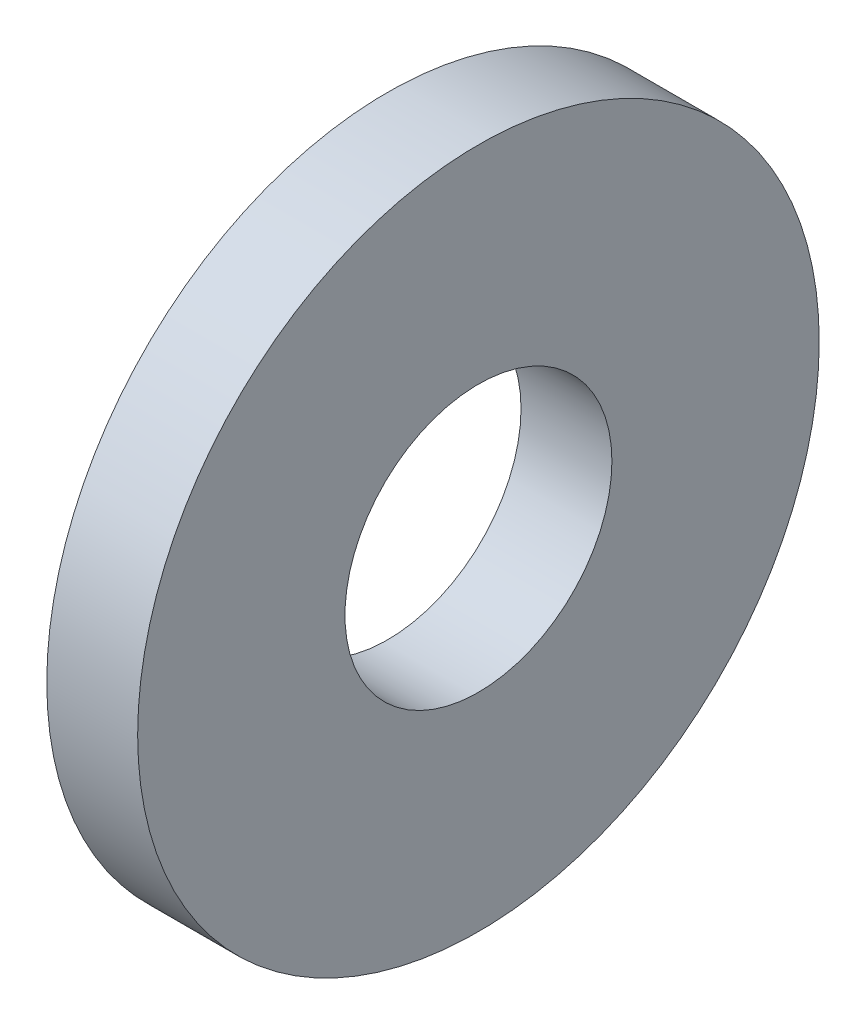
ISO-10303-21;
HEADER;
FILE_DESCRIPTION(('STEP AP214'),'2;1');
FILE_NAME('part.step','',(''),(''),'','','');
FILE_SCHEMA(('AUTOMOTIVE_DESIGN { 1 0 10303 214 1 1 1 1 }'));
ENDSEC;
DATA;
#1=APPLICATION_CONTEXT('core data for automotive mechanical design processes');
#2=APPLICATION_PROTOCOL_DEFINITION('international standard','automotive_design',2000,#1);
#3=PRODUCT_CONTEXT('',#1,'mechanical');
#4=PRODUCT('Part','Part','',(#3));
#5=PRODUCT_RELATED_PRODUCT_CATEGORY('part','',(#4));
#6=PRODUCT_DEFINITION_FORMATION('','',#4);
#7=PRODUCT_DEFINITION_CONTEXT('part definition',#1,'design');
#8=PRODUCT_DEFINITION('design','',#6,#7);
#9=PRODUCT_DEFINITION_SHAPE('','',#8);
#10=(LENGTH_UNIT() NAMED_UNIT(*) SI_UNIT(.MILLI.,.METRE.));
#11=(NAMED_UNIT(*) PLANE_ANGLE_UNIT() SI_UNIT($,.RADIAN.));
#12=(NAMED_UNIT(*) SI_UNIT($,.STERADIAN.) SOLID_ANGLE_UNIT());
#13=UNCERTAINTY_MEASURE_WITH_UNIT(LENGTH_MEASURE(1.E-05),#10,'distance_accuracy_value','');
#14=(GEOMETRIC_REPRESENTATION_CONTEXT(3) GLOBAL_UNCERTAINTY_ASSIGNED_CONTEXT((#13)) GLOBAL_UNIT_ASSIGNED_CONTEXT((#10,
#11,#12)) REPRESENTATION_CONTEXT('',''));
#15=CARTESIAN_POINT('',(0.,0.,0.));
#16=DIRECTION('',(0.,0.,1.));
#17=DIRECTION('',(1.,0.,0.));
#18=AXIS2_PLACEMENT_3D('',#15,#16,#17);
#19=CARTESIAN_POINT('',(1.6,0.,0.));
#20=DIRECTION('',(1.,0.,0.));
#21=DIRECTION('',(0.,0.,-1.));
#22=AXIS2_PLACEMENT_3D('',#19,#20,#21);
#23=PLANE('',#22);
#24=CARTESIAN_POINT('',(1.6,0.,0.));
#25=DIRECTION('',(1.,0.,0.));
#26=DIRECTION('',(0.,0.,-1.));
#27=AXIS2_PLACEMENT_3D('',#24,#25,#26);
#28=CIRCLE('',#27,6.);
#29=CARTESIAN_POINT('',(1.6,0.,-6.));
#30=VERTEX_POINT('',#29);
#31=EDGE_CURVE('E10',#30,#30,#28,.T.);
#32=ORIENTED_EDGE('',*,*,#31,.T.);
#33=EDGE_LOOP('',(#32));
#34=FACE_BOUND('',#33,.T.);
#35=CARTESIAN_POINT('',(1.6,0.,0.));
#36=DIRECTION('',(1.,0.,0.));
#37=DIRECTION('',(0.,0.,-1.));
#38=AXIS2_PLACEMENT_3D('',#35,#36,#37);
#39=CIRCLE('',#38,2.35);
#40=CARTESIAN_POINT('',(1.6,0.,-2.35));
#41=VERTEX_POINT('',#40);
#42=EDGE_CURVE('E48',#41,#41,#39,.T.);
#43=ORIENTED_EDGE('',*,*,#42,.F.);
#44=EDGE_LOOP('',(#43));
#45=FACE_BOUND('',#44,.T.);
#46=ADVANCED_FACE('F37',(#34,#45),#23,.T.);
#47=CARTESIAN_POINT('',(0.,0.,0.));
#48=DIRECTION('',(1.,0.,0.));
#49=DIRECTION('',(0.,0.,-1.));
#50=AXIS2_PLACEMENT_3D('',#47,#48,#49);
#51=PLANE('',#50);
#52=CARTESIAN_POINT('',(0.,0.,0.));
#53=DIRECTION('',(1.,0.,0.));
#54=DIRECTION('',(0.,0.,-1.));
#55=AXIS2_PLACEMENT_3D('',#52,#53,#54);
#56=CIRCLE('',#55,6.);
#57=CARTESIAN_POINT('',(0.,0.,-6.));
#58=VERTEX_POINT('',#57);
#59=EDGE_CURVE('E41',#58,#58,#56,.T.);
#60=ORIENTED_EDGE('',*,*,#59,.F.);
#61=EDGE_LOOP('',(#60));
#62=FACE_BOUND('',#61,.T.);
#63=CARTESIAN_POINT('',(0.,0.,0.));
#64=DIRECTION('',(1.,0.,0.));
#65=DIRECTION('',(0.,0.,-1.));
#66=AXIS2_PLACEMENT_3D('',#63,#64,#65);
#67=CIRCLE('',#66,2.35);
#68=CARTESIAN_POINT('',(0.,0.,-2.35));
#69=VERTEX_POINT('',#68);
#70=EDGE_CURVE('E50',#69,#69,#67,.T.);
#71=ORIENTED_EDGE('',*,*,#70,.T.);
#72=EDGE_LOOP('',(#71));
#73=FACE_BOUND('',#72,.T.);
#74=ADVANCED_FACE('F60',(#62,#73),#51,.F.);
#75=CARTESIAN_POINT('',(1.6,0.,0.));
#76=DIRECTION('',(-1.,0.,0.));
#77=DIRECTION('',(0.,0.,1.));
#78=AXIS2_PLACEMENT_3D('',#75,#76,#77);
#79=CYLINDRICAL_SURFACE('',#78,6.);
#80=ORIENTED_EDGE('',*,*,#31,.F.);
#81=EDGE_LOOP('',(#80));
#82=FACE_BOUND('',#81,.T.);
#83=ORIENTED_EDGE('',*,*,#59,.T.);
#84=EDGE_LOOP('',(#83));
#85=FACE_BOUND('',#84,.T.);
#86=ADVANCED_FACE('F39',(#82,#85),#79,.T.);
#87=CARTESIAN_POINT('',(1.6,0.,0.));
#88=DIRECTION('',(-1.,0.,0.));
#89=DIRECTION('',(0.,0.,1.));
#90=AXIS2_PLACEMENT_3D('',#87,#88,#89);
#91=CYLINDRICAL_SURFACE('',#90,2.35);
#92=ORIENTED_EDGE('',*,*,#42,.T.);
#93=EDGE_LOOP('',(#92));
#94=FACE_BOUND('',#93,.T.);
#95=ORIENTED_EDGE('',*,*,#70,.F.);
#96=EDGE_LOOP('',(#95));
#97=FACE_BOUND('',#96,.T.);
#98=ADVANCED_FACE('F56',(#94,#97),#91,.F.);
#99=CLOSED_SHELL('',(#46,#74,#86,#98));
#100=MANIFOLD_SOLID_BREP('B2',#99);
#101=ADVANCED_BREP_SHAPE_REPRESENTATION('',(#18,#100),#14);
#102=SHAPE_DEFINITION_REPRESENTATION(#9,#101);
ENDSEC;
END-ISO-10303-21;
